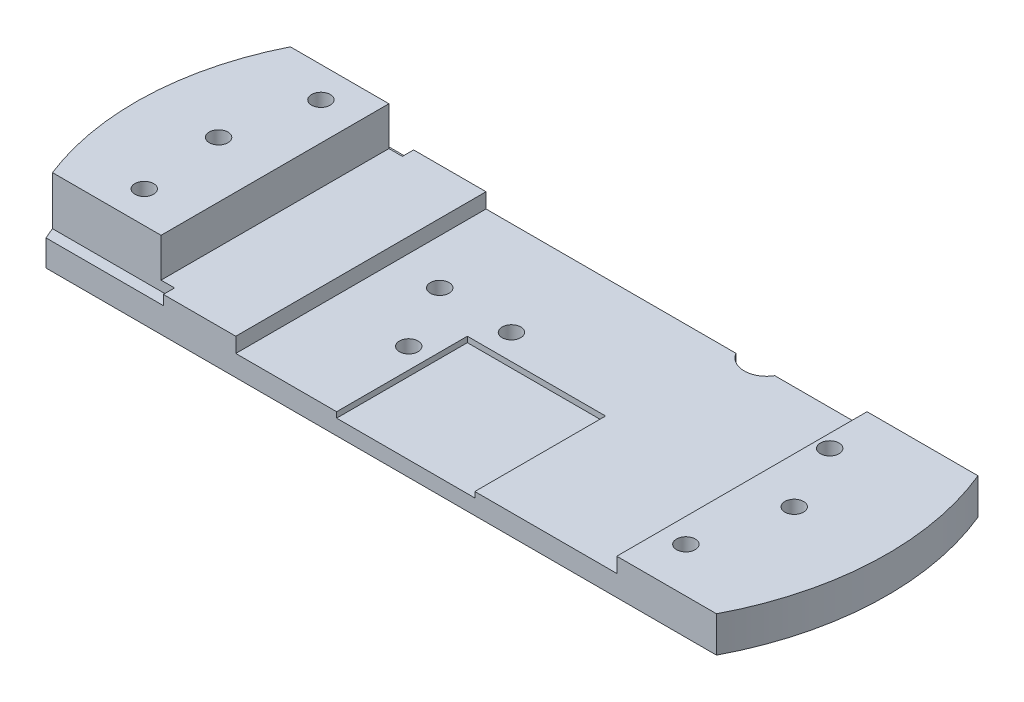
ISO-10303-21;
HEADER;
FILE_DESCRIPTION(('STEP AP214'),'2;1');
FILE_NAME('part.step','',(''),(''),'','','');
FILE_SCHEMA(('AUTOMOTIVE_DESIGN { 1 0 10303 214 1 1 1 1 }'));
ENDSEC;
DATA;
#1=APPLICATION_CONTEXT('core data for automotive mechanical design processes');
#2=APPLICATION_PROTOCOL_DEFINITION('international standard','automotive_design',2000,#1);
#3=PRODUCT_CONTEXT('',#1,'mechanical');
#4=PRODUCT('Part','Part','',(#3));
#5=PRODUCT_RELATED_PRODUCT_CATEGORY('part','',(#4));
#6=PRODUCT_DEFINITION_FORMATION('','',#4);
#7=PRODUCT_DEFINITION_CONTEXT('part definition',#1,'design');
#8=PRODUCT_DEFINITION('design','',#6,#7);
#9=PRODUCT_DEFINITION_SHAPE('','',#8);
#10=(LENGTH_UNIT() NAMED_UNIT(*) SI_UNIT(.MILLI.,.METRE.));
#11=(NAMED_UNIT(*) PLANE_ANGLE_UNIT() SI_UNIT($,.RADIAN.));
#12=(NAMED_UNIT(*) SI_UNIT($,.STERADIAN.) SOLID_ANGLE_UNIT());
#13=UNCERTAINTY_MEASURE_WITH_UNIT(LENGTH_MEASURE(1.E-05),#10,'distance_accuracy_value','');
#14=(GEOMETRIC_REPRESENTATION_CONTEXT(3) GLOBAL_UNCERTAINTY_ASSIGNED_CONTEXT((#13)) GLOBAL_UNIT_ASSIGNED_CONTEXT((#10,
#11,#12)) REPRESENTATION_CONTEXT('',''));
#15=CARTESIAN_POINT('',(0.,0.,0.));
#16=DIRECTION('',(0.,0.,1.));
#17=DIRECTION('',(1.,0.,0.));
#18=AXIS2_PLACEMENT_3D('',#15,#16,#17);
#19=CARTESIAN_POINT('',(0.,20.,0.));
#20=DIRECTION('',(0.,-1.,0.));
#21=DIRECTION('',(0.,0.,-1.));
#22=AXIS2_PLACEMENT_3D('',#19,#20,#21);
#23=PLANE('',#22);
#24=CARTESIAN_POINT('',(-76.2,20.,22.));
#25=DIRECTION('',(0.,-1.,0.));
#26=DIRECTION('',(0.,0.,-1.));
#27=AXIS2_PLACEMENT_3D('',#24,#25,#26);
#28=CIRCLE('',#27,2.50000000000001);
#29=CARTESIAN_POINT('',(-76.2,20.,19.5));
#30=VERTEX_POINT('',#29);
#31=EDGE_CURVE('E300',#30,#30,#28,.T.);
#32=ORIENTED_EDGE('',*,*,#31,.T.);
#33=EDGE_LOOP('',(#32));
#34=FACE_BOUND('',#33,.T.);
#35=CARTESIAN_POINT('',(-78.2,20.,0.100000000000003));
#36=DIRECTION('',(0.,-1.,0.));
#37=DIRECTION('',(0.,0.,-1.));
#38=AXIS2_PLACEMENT_3D('',#35,#36,#37);
#39=CIRCLE('',#38,2.49999999999999);
#40=CARTESIAN_POINT('',(-78.2,20.,-2.39999999999999));
#41=VERTEX_POINT('',#40);
#42=EDGE_CURVE('E306',#41,#41,#39,.T.);
#43=ORIENTED_EDGE('',*,*,#42,.T.);
#44=EDGE_LOOP('',(#43));
#45=FACE_BOUND('',#44,.T.);
#46=CARTESIAN_POINT('',(-73.2,20.,-22.3));
#47=DIRECTION('',(0.,-1.,0.));
#48=DIRECTION('',(0.,0.,-1.));
#49=AXIS2_PLACEMENT_3D('',#46,#47,#48);
#50=CIRCLE('',#49,2.50000000000001);
#51=CARTESIAN_POINT('',(-73.2,20.,-24.8));
#52=VERTEX_POINT('',#51);
#53=EDGE_CURVE('E278',#52,#52,#50,.T.);
#54=ORIENTED_EDGE('',*,*,#53,.T.);
#55=EDGE_LOOP('',(#54));
#56=FACE_BOUND('',#55,.T.);
#57=DIRECTION('',(-1.,0.,0.));
#58=VECTOR('',#57,1.);
#59=CARTESIAN_POINT('',(0.,20.,-30.5));
#60=LINE('',#59,#58);
#61=CARTESIAN_POINT('',(-63.2,20.,-30.5));
#62=VERTEX_POINT('',#61);
#63=CARTESIAN_POINT('',(-89.5873446539231,20.,-30.5));
#64=VERTEX_POINT('',#63);
#65=EDGE_CURVE('E317',#62,#64,#60,.T.);
#66=ORIENTED_EDGE('',*,*,#65,.T.);
#67=CARTESIAN_POINT('',(-22.6589151875398,20.,2.99288439458776));
#68=DIRECTION('',(0.,-1.,0.));
#69=DIRECTION('',(0.,0.,-1.));
#70=AXIS2_PLACEMENT_3D('',#67,#68,#69);
#71=CIRCLE('',#70,74.8410848124602);
#72=CARTESIAN_POINT('',(-92.2616921937509,20.,30.5));
#73=VERTEX_POINT('',#72);
#74=EDGE_CURVE('E414',#73,#64,#71,.T.);
#75=ORIENTED_EDGE('',*,*,#74,.F.);
#76=DIRECTION('',(-1.,0.,0.));
#77=VECTOR('',#76,1.);
#78=CARTESIAN_POINT('',(0.,20.,30.5));
#79=LINE('',#78,#77);
#80=CARTESIAN_POINT('',(-63.2,20.,30.5));
#81=VERTEX_POINT('',#80);
#82=EDGE_CURVE('E339',#81,#73,#79,.T.);
#83=ORIENTED_EDGE('',*,*,#82,.F.);
#84=DIRECTION('',(0.,0.,1.));
#85=VECTOR('',#84,1.);
#86=CARTESIAN_POINT('',(-63.2,20.,-33.5));
#87=LINE('',#86,#85);
#88=EDGE_CURVE('E399',#62,#81,#87,.T.);
#89=ORIENTED_EDGE('',*,*,#88,.F.);
#90=EDGE_LOOP('',(#66,#75,#83,#89));
#91=FACE_BOUND('',#90,.T.);
#92=ADVANCED_FACE('F84',(#34,#45,#56,#91),#23,.F.);
#93=CARTESIAN_POINT('',(-97.5,20.,-33.5));
#94=DIRECTION('',(0.,0.,1.));
#95=DIRECTION('',(1.,0.,0.));
#96=AXIS2_PLACEMENT_3D('',#93,#94,#95);
#97=PLANE('',#96);
#98=DIRECTION('',(1.,0.,0.));
#99=VECTOR('',#98,1.);
#100=CARTESIAN_POINT('',(0.,1.5,-33.5));
#101=LINE('',#100,#99);
#102=CARTESIAN_POINT('',(26.7038475772934,1.5,-33.5));
#103=VERTEX_POINT('',#102);
#104=CARTESIAN_POINT('',(37.0961524227066,1.5,-33.5));
#105=VERTEX_POINT('',#104);
#106=EDGE_CURVE('E234',#103,#105,#101,.T.);
#107=ORIENTED_EDGE('',*,*,#106,.T.);
#108=DIRECTION('',(0.,1.,0.));
#109=VECTOR('',#108,1.);
#110=CARTESIAN_POINT('',(37.0961524227066,1.5,-33.5));
#111=LINE('',#110,#109);
#112=CARTESIAN_POINT('',(37.0961524227066,5.6,-33.5));
#113=VERTEX_POINT('',#112);
#114=EDGE_CURVE('E241',#105,#113,#111,.T.);
#115=ORIENTED_EDGE('',*,*,#114,.T.);
#116=DIRECTION('',(1.,0.,0.));
#117=VECTOR('',#116,1.);
#118=CARTESIAN_POINT('',(0.,5.6,-33.5));
#119=LINE('',#118,#117);
#120=CARTESIAN_POINT('',(61.8,5.59999999999999,-33.5));
#121=VERTEX_POINT('',#120);
#122=EDGE_CURVE('E372',#113,#121,#119,.T.);
#123=ORIENTED_EDGE('',*,*,#122,.T.);
#124=DIRECTION('',(0.,1.,0.));
#125=VECTOR('',#124,1.);
#126=CARTESIAN_POINT('',(61.8,0.,-33.5));
#127=LINE('',#126,#125);
#128=CARTESIAN_POINT('',(61.8,9.59999999999997,-33.5));
#129=VERTEX_POINT('',#128);
#130=EDGE_CURVE('E361',#121,#129,#127,.T.);
#131=ORIENTED_EDGE('',*,*,#130,.T.);
#132=DIRECTION('',(1.,0.,0.));
#133=VECTOR('',#132,1.);
#134=CARTESIAN_POINT('',(0.,9.6,-33.5));
#135=LINE('',#134,#133);
#136=CARTESIAN_POINT('',(91.5,9.59999999999996,-33.5));
#137=VERTEX_POINT('',#136);
#138=EDGE_CURVE('E364',#129,#137,#135,.T.);
#139=ORIENTED_EDGE('',*,*,#138,.T.);
#140=DIRECTION('',(0.,-1.,0.));
#141=VECTOR('',#140,1.);
#142=CARTESIAN_POINT('',(91.5,20.,-33.5));
#143=LINE('',#142,#141);
#144=CARTESIAN_POINT('',(91.5,0.,-33.5));
#145=VERTEX_POINT('',#144);
#146=EDGE_CURVE('E403',#137,#145,#143,.T.);
#147=ORIENTED_EDGE('',*,*,#146,.T.);
#148=DIRECTION('',(-1.,0.,0.));
#149=VECTOR('',#148,1.);
#150=CARTESIAN_POINT('',(-97.5,0.,-33.5));
#151=LINE('',#150,#149);
#152=CARTESIAN_POINT('',(-88.,0.,-33.5));
#153=VERTEX_POINT('',#152);
#154=EDGE_CURVE('E413',#145,#153,#151,.T.);
#155=ORIENTED_EDGE('',*,*,#154,.T.);
#156=DIRECTION('',(0.,-1.,0.));
#157=VECTOR('',#156,1.);
#158=CARTESIAN_POINT('',(-88.,20.,-33.5));
#159=LINE('',#158,#157);
#160=CARTESIAN_POINT('',(-88.,7.,-33.5));
#161=VERTEX_POINT('',#160);
#162=EDGE_CURVE('E390',#161,#153,#159,.T.);
#163=ORIENTED_EDGE('',*,*,#162,.F.);
#164=DIRECTION('',(-1.,0.,0.));
#165=VECTOR('',#164,1.);
#166=CARTESIAN_POINT('',(0.,7.,-33.5));
#167=LINE('',#166,#165);
#168=CARTESIAN_POINT('',(-59.5873446539231,7.,-33.5));
#169=VERTEX_POINT('',#168);
#170=EDGE_CURVE('E319',#169,#161,#167,.T.);
#171=ORIENTED_EDGE('',*,*,#170,.F.);
#172=DIRECTION('',(0.,1.,0.));
#173=VECTOR('',#172,1.);
#174=CARTESIAN_POINT('',(-59.5873446539231,7.,-33.5));
#175=LINE('',#174,#173);
#176=CARTESIAN_POINT('',(-59.5873446539231,9.6,-33.5));
#177=VERTEX_POINT('',#176);
#178=EDGE_CURVE('E331',#169,#177,#175,.T.);
#179=ORIENTED_EDGE('',*,*,#178,.T.);
#180=DIRECTION('',(1.,0.,0.));
#181=VECTOR('',#180,1.);
#182=CARTESIAN_POINT('',(0.,9.6,-33.5));
#183=LINE('',#182,#181);
#184=CARTESIAN_POINT('',(-40.2,9.6,-33.5));
#185=VERTEX_POINT('',#184);
#186=EDGE_CURVE('E368',#177,#185,#183,.T.);
#187=ORIENTED_EDGE('',*,*,#186,.T.);
#188=DIRECTION('',(0.,-1.,0.));
#189=VECTOR('',#188,1.);
#190=CARTESIAN_POINT('',(-40.1999999999999,-2.7894353493707E-13,-33.5));
#191=LINE('',#190,#189);
#192=CARTESIAN_POINT('',(-40.2,5.6,-33.5));
#193=VERTEX_POINT('',#192);
#194=EDGE_CURVE('E370',#185,#193,#191,.T.);
#195=ORIENTED_EDGE('',*,*,#194,.T.);
#196=CARTESIAN_POINT('',(26.7038475772934,5.6,-33.5));
#197=VERTEX_POINT('',#196);
#198=EDGE_CURVE('E246',#193,#197,#119,.T.);
#199=ORIENTED_EDGE('',*,*,#198,.T.);
#200=DIRECTION('',(0.,1.,0.));
#201=VECTOR('',#200,1.);
#202=CARTESIAN_POINT('',(26.7038475772934,1.5,-33.5));
#203=LINE('',#202,#201);
#204=EDGE_CURVE('E99',#103,#197,#203,.T.);
#205=ORIENTED_EDGE('',*,*,#204,.F.);
#206=EDGE_LOOP('',(#107,#115,#123,#131,#139,#147,#155,#163,#171,#179,#187,#195,#199,#205));
#207=FACE_BOUND('',#206,.T.);
#208=ADVANCED_FACE('F86',(#207),#97,.F.);
#209=CARTESIAN_POINT('',(-22.6589151875398,20.,2.99288439458776));
#210=DIRECTION('',(0.,-1.,0.));
#211=DIRECTION('',(0.,0.,-1.));
#212=AXIS2_PLACEMENT_3D('',#209,#210,#211);
#213=CYLINDRICAL_SURFACE('',#212,74.8410848124602);
#214=ORIENTED_EDGE('',*,*,#74,.T.);
#215=DIRECTION('',(0.,1.,0.));
#216=VECTOR('',#215,1.);
#217=CARTESIAN_POINT('',(-89.5873446539231,7.,-30.5));
#218=LINE('',#217,#216);
#219=CARTESIAN_POINT('',(-89.5873446539231,7.,-30.5));
#220=VERTEX_POINT('',#219);
#221=EDGE_CURVE('E328',#220,#64,#218,.T.);
#222=ORIENTED_EDGE('',*,*,#221,.F.);
#223=CARTESIAN_POINT('',(-22.6589151875398,7.,2.99288439458776));
#224=DIRECTION('',(0.,1.,0.));
#225=DIRECTION('',(0.,0.,1.));
#226=AXIS2_PLACEMENT_3D('',#223,#224,#225);
#227=CIRCLE('',#226,74.8410848124602);
#228=EDGE_CURVE('E321',#161,#220,#227,.T.);
#229=ORIENTED_EDGE('',*,*,#228,.F.);
#230=ORIENTED_EDGE('',*,*,#162,.T.);
#231=CARTESIAN_POINT('',(-22.6589151875398,0.,2.99288439458776));
#232=DIRECTION('',(0.,-1.,0.));
#233=DIRECTION('',(0.,0.,-1.));
#234=AXIS2_PLACEMENT_3D('',#231,#232,#233);
#235=CIRCLE('',#234,74.8410848124602);
#236=CARTESIAN_POINT('',(-91.,0.,33.5));
#237=VERTEX_POINT('',#236);
#238=EDGE_CURVE('E405',#237,#153,#235,.T.);
#239=ORIENTED_EDGE('',*,*,#238,.F.);
#240=DIRECTION('',(0.,-1.,0.));
#241=VECTOR('',#240,1.);
#242=CARTESIAN_POINT('',(-91.,20.,33.5));
#243=LINE('',#242,#241);
#244=CARTESIAN_POINT('',(-91.,7.,33.5));
#245=VERTEX_POINT('',#244);
#246=EDGE_CURVE('E411',#245,#237,#243,.T.);
#247=ORIENTED_EDGE('',*,*,#246,.F.);
#248=CARTESIAN_POINT('',(-22.6589151875398,7.,2.99288439458776));
#249=DIRECTION('',(0.,1.,0.));
#250=DIRECTION('',(0.,0.,1.));
#251=AXIS2_PLACEMENT_3D('',#248,#249,#250);
#252=CIRCLE('',#251,74.8410848124602);
#253=CARTESIAN_POINT('',(-92.2616921937509,7.,30.5));
#254=VERTEX_POINT('',#253);
#255=EDGE_CURVE('E345',#254,#245,#252,.T.);
#256=ORIENTED_EDGE('',*,*,#255,.F.);
#257=DIRECTION('',(0.,1.,0.));
#258=VECTOR('',#257,1.);
#259=CARTESIAN_POINT('',(-92.2616921937509,7.,30.5));
#260=LINE('',#259,#258);
#261=EDGE_CURVE('E327',#254,#73,#260,.T.);
#262=ORIENTED_EDGE('',*,*,#261,.T.);
#263=EDGE_LOOP('',(#214,#222,#229,#230,#239,#247,#256,#262));
#264=FACE_BOUND('',#263,.T.);
#265=ADVANCED_FACE('F479',(#264),#213,.T.);
#266=CARTESIAN_POINT('',(-63.2,0.,-33.5));
#267=DIRECTION('',(-1.,0.,0.));
#268=DIRECTION('',(0.,-1.,0.));
#269=AXIS2_PLACEMENT_3D('',#266,#267,#268);
#270=PLANE('',#269);
#271=DIRECTION('',(0.,-1.,0.));
#272=VECTOR('',#271,1.);
#273=CARTESIAN_POINT('',(-63.2,0.,-30.5));
#274=LINE('',#273,#272);
#275=CARTESIAN_POINT('',(-63.2,9.6,-30.5));
#276=VERTEX_POINT('',#275);
#277=EDGE_CURVE('E358',#62,#276,#274,.T.);
#278=ORIENTED_EDGE('',*,*,#277,.F.);
#279=ORIENTED_EDGE('',*,*,#88,.T.);
#280=DIRECTION('',(0.,-1.,0.));
#281=VECTOR('',#280,1.);
#282=CARTESIAN_POINT('',(-63.2,0.,30.5));
#283=LINE('',#282,#281);
#284=CARTESIAN_POINT('',(-63.2,9.6,30.5));
#285=VERTEX_POINT('',#284);
#286=EDGE_CURVE('E330',#81,#285,#283,.T.);
#287=ORIENTED_EDGE('',*,*,#286,.T.);
#288=DIRECTION('',(0.,0.,1.));
#289=VECTOR('',#288,1.);
#290=CARTESIAN_POINT('',(-63.2,9.6,-33.5));
#291=LINE('',#290,#289);
#292=EDGE_CURVE('E396',#276,#285,#291,.T.);
#293=ORIENTED_EDGE('',*,*,#292,.F.);
#294=EDGE_LOOP('',(#278,#279,#287,#293));
#295=FACE_BOUND('',#294,.T.);
#296=ADVANCED_FACE('F597',(#295),#270,.F.);
#297=CARTESIAN_POINT('',(0.,9.6,-33.5));
#298=DIRECTION('',(0.,-1.,0.));
#299=DIRECTION('',(0.,0.,-1.));
#300=AXIS2_PLACEMENT_3D('',#297,#298,#299);
#301=PLANE('',#300);
#302=DIRECTION('',(1.,0.,0.));
#303=VECTOR('',#302,1.);
#304=CARTESIAN_POINT('',(0.,9.6,-30.5));
#305=LINE('',#304,#303);
#306=CARTESIAN_POINT('',(-59.5873446539231,9.6,-30.5));
#307=VERTEX_POINT('',#306);
#308=EDGE_CURVE('E92',#276,#307,#305,.T.);
#309=ORIENTED_EDGE('',*,*,#308,.F.);
#310=ORIENTED_EDGE('',*,*,#292,.T.);
#311=DIRECTION('',(1.,0.,0.));
#312=VECTOR('',#311,1.);
#313=CARTESIAN_POINT('',(0.,9.6,30.5));
#314=LINE('',#313,#312);
#315=CARTESIAN_POINT('',(-59.5873446539231,9.6,30.5));
#316=VERTEX_POINT('',#315);
#317=EDGE_CURVE('E430',#285,#316,#314,.T.);
#318=ORIENTED_EDGE('',*,*,#317,.T.);
#319=DIRECTION('',(0.,0.,1.));
#320=VECTOR('',#319,1.);
#321=CARTESIAN_POINT('',(-59.5873446539233,9.6,-33.4999999999999));
#322=LINE('',#321,#320);
#323=CARTESIAN_POINT('',(-59.5873446539231,9.6,33.5));
#324=VERTEX_POINT('',#323);
#325=EDGE_CURVE('E427',#316,#324,#322,.T.);
#326=ORIENTED_EDGE('',*,*,#325,.T.);
#327=DIRECTION('',(1.,0.,0.));
#328=VECTOR('',#327,1.);
#329=CARTESIAN_POINT('',(0.,9.6,33.5));
#330=LINE('',#329,#328);
#331=CARTESIAN_POINT('',(-40.2,9.6,33.5));
#332=VERTEX_POINT('',#331);
#333=EDGE_CURVE('E379',#324,#332,#330,.T.);
#334=ORIENTED_EDGE('',*,*,#333,.T.);
#335=DIRECTION('',(0.,0.,1.));
#336=VECTOR('',#335,1.);
#337=CARTESIAN_POINT('',(-40.2,9.6,-33.5));
#338=LINE('',#337,#336);
#339=EDGE_CURVE('E393',#185,#332,#338,.T.);
#340=ORIENTED_EDGE('',*,*,#339,.F.);
#341=ORIENTED_EDGE('',*,*,#186,.F.);
#342=DIRECTION('',(0.,0.,-1.));
#343=VECTOR('',#342,1.);
#344=CARTESIAN_POINT('',(-59.5873446539231,9.6,-33.5));
#345=LINE('',#344,#343);
#346=EDGE_CURVE('E433',#307,#177,#345,.T.);
#347=ORIENTED_EDGE('',*,*,#346,.F.);
#348=EDGE_LOOP('',(#309,#310,#318,#326,#334,#340,#341,#347));
#349=FACE_BOUND('',#348,.T.);
#350=ADVANCED_FACE('F487',(#349),#301,.F.);
#351=CARTESIAN_POINT('',(0.,0.,0.));
#352=DIRECTION('',(0.,-1.,0.));
#353=DIRECTION('',(0.,0.,-1.));
#354=AXIS2_PLACEMENT_3D('',#351,#352,#353);
#355=PLANE('',#354);
#356=CARTESIAN_POINT('',(-8.20000000000003,0.,-8.3));
#357=DIRECTION('',(0.,-1.,0.));
#358=DIRECTION('',(0.,0.,-1.));
#359=AXIS2_PLACEMENT_3D('',#356,#357,#358);
#360=CIRCLE('',#359,2.5);
#361=CARTESIAN_POINT('',(-8.20000000000003,0.,-10.8));
#362=VERTEX_POINT('',#361);
#363=EDGE_CURVE('E293',#362,#362,#360,.T.);
#364=ORIENTED_EDGE('',*,*,#363,.F.);
#365=EDGE_LOOP('',(#364));
#366=FACE_BOUND('',#365,.T.);
#367=CARTESIAN_POINT('',(-18.7,0.,8.7));
#368=DIRECTION('',(0.,-1.,0.));
#369=DIRECTION('',(0.,0.,-1.));
#370=AXIS2_PLACEMENT_3D('',#367,#368,#369);
#371=CIRCLE('',#370,2.5);
#372=CARTESIAN_POINT('',(-18.7,0.,6.2));
#373=VERTEX_POINT('',#372);
#374=EDGE_CURVE('E297',#373,#373,#371,.T.);
#375=ORIENTED_EDGE('',*,*,#374,.F.);
#376=EDGE_LOOP('',(#375));
#377=FACE_BOUND('',#376,.T.);
#378=CARTESIAN_POINT('',(-76.2,0.,22.));
#379=DIRECTION('',(0.,-1.,0.));
#380=DIRECTION('',(0.,0.,-1.));
#381=AXIS2_PLACEMENT_3D('',#378,#379,#380);
#382=CIRCLE('',#381,2.50000000000001);
#383=CARTESIAN_POINT('',(-76.2,0.,19.5));
#384=VERTEX_POINT('',#383);
#385=EDGE_CURVE('E303',#384,#384,#382,.T.);
#386=ORIENTED_EDGE('',*,*,#385,.F.);
#387=EDGE_LOOP('',(#386));
#388=FACE_BOUND('',#387,.T.);
#389=CARTESIAN_POINT('',(-78.2,0.,0.100000000000003));
#390=DIRECTION('',(0.,-1.,0.));
#391=DIRECTION('',(0.,0.,-1.));
#392=AXIS2_PLACEMENT_3D('',#389,#390,#391);
#393=CIRCLE('',#392,2.49999999999999);
#394=CARTESIAN_POINT('',(-78.2,0.,-2.39999999999999));
#395=VERTEX_POINT('',#394);
#396=EDGE_CURVE('E281',#395,#395,#393,.T.);
#397=ORIENTED_EDGE('',*,*,#396,.F.);
#398=EDGE_LOOP('',(#397));
#399=FACE_BOUND('',#398,.T.);
#400=CARTESIAN_POINT('',(-73.2,0.,-22.3));
#401=DIRECTION('',(0.,-1.,0.));
#402=DIRECTION('',(0.,0.,-1.));
#403=AXIS2_PLACEMENT_3D('',#400,#401,#402);
#404=CIRCLE('',#403,2.50000000000001);
#405=CARTESIAN_POINT('',(-73.2,0.,-24.8));
#406=VERTEX_POINT('',#405);
#407=EDGE_CURVE('E282',#406,#406,#404,.T.);
#408=ORIENTED_EDGE('',*,*,#407,.F.);
#409=EDGE_LOOP('',(#408));
#410=FACE_BOUND('',#409,.T.);
#411=CARTESIAN_POINT('',(65.3,0.,-20.));
#412=DIRECTION('',(0.,-1.,0.));
#413=DIRECTION('',(0.,0.,-1.));
#414=AXIS2_PLACEMENT_3D('',#411,#412,#413);
#415=CIRCLE('',#414,2.50000000000001);
#416=CARTESIAN_POINT('',(65.3,0.,-22.5));
#417=VERTEX_POINT('',#416);
#418=EDGE_CURVE('E285',#417,#417,#415,.T.);
#419=ORIENTED_EDGE('',*,*,#418,.F.);
#420=EDGE_LOOP('',(#419));
#421=FACE_BOUND('',#420,.T.);
#422=CARTESIAN_POINT('',(74.1,0.,-1.7));
#423=DIRECTION('',(0.,-1.,0.));
#424=DIRECTION('',(0.,0.,-1.));
#425=AXIS2_PLACEMENT_3D('',#422,#423,#424);
#426=CIRCLE('',#425,2.5);
#427=CARTESIAN_POINT('',(74.1,0.,-4.2));
#428=VERTEX_POINT('',#427);
#429=EDGE_CURVE('E288',#428,#428,#426,.T.);
#430=ORIENTED_EDGE('',*,*,#429,.F.);
#431=EDGE_LOOP('',(#430));
#432=FACE_BOUND('',#431,.T.);
#433=CARTESIAN_POINT('',(68.3,0.,21.5));
#434=DIRECTION('',(0.,-1.,0.));
#435=DIRECTION('',(0.,0.,-1.));
#436=AXIS2_PLACEMENT_3D('',#433,#434,#435);
#437=CIRCLE('',#436,2.5);
#438=CARTESIAN_POINT('',(68.3,0.,19.));
#439=VERTEX_POINT('',#438);
#440=EDGE_CURVE('E272',#439,#439,#437,.T.);
#441=ORIENTED_EDGE('',*,*,#440,.F.);
#442=EDGE_LOOP('',(#441));
#443=FACE_BOUND('',#442,.T.);
#444=CARTESIAN_POINT('',(-28.1,0.,-9.));
#445=DIRECTION('',(0.,-1.,0.));
#446=DIRECTION('',(0.,0.,-1.));
#447=AXIS2_PLACEMENT_3D('',#444,#445,#446);
#448=CIRCLE('',#447,2.5);
#449=CARTESIAN_POINT('',(-28.1,0.,-11.5));
#450=VERTEX_POINT('',#449);
#451=EDGE_CURVE('E296',#450,#450,#448,.T.);
#452=ORIENTED_EDGE('',*,*,#451,.F.);
#453=EDGE_LOOP('',(#452));
#454=FACE_BOUND('',#453,.T.);
#455=ORIENTED_EDGE('',*,*,#154,.F.);
#456=CARTESIAN_POINT('',(18.092213290183,0.,-3.21975164372315));
#457=DIRECTION('',(0.,-1.,0.));
#458=DIRECTION('',(0.,0.,-1.));
#459=AXIS2_PLACEMENT_3D('',#456,#457,#458);
#460=CIRCLE('',#459,79.407786709817);
#461=CARTESIAN_POINT('',(88.5,0.,33.5));
#462=VERTEX_POINT('',#461);
#463=EDGE_CURVE('E407',#145,#462,#460,.T.);
#464=ORIENTED_EDGE('',*,*,#463,.T.);
#465=DIRECTION('',(1.,0.,0.));
#466=VECTOR('',#465,1.);
#467=CARTESIAN_POINT('',(-97.5,0.,33.5));
#468=LINE('',#467,#466);
#469=EDGE_CURVE('E422',#237,#462,#468,.T.);
#470=ORIENTED_EDGE('',*,*,#469,.F.);
#471=ORIENTED_EDGE('',*,*,#238,.T.);
#472=EDGE_LOOP('',(#455,#464,#470,#471));
#473=FACE_BOUND('',#472,.T.);
#474=ADVANCED_FACE('F484',(#366,#377,#388,#399,#410,#421,#432,#443,#454,#473),#355,.T.);
#475=CARTESIAN_POINT('',(-97.5,20.,33.5));
#476=DIRECTION('',(0.,0.,-1.));
#477=DIRECTION('',(-1.,0.,0.));
#478=AXIS2_PLACEMENT_3D('',#475,#476,#477);
#479=PLANE('',#478);
#480=DIRECTION('',(1.,0.,0.));
#481=VECTOR('',#480,1.);
#482=CARTESIAN_POINT('',(-13.2,4.1,33.5));
#483=LINE('',#482,#481);
#484=CARTESIAN_POINT('',(-13.2,4.1,33.5));
#485=VERTEX_POINT('',#484);
#486=CARTESIAN_POINT('',(23.8,4.1,33.5));
#487=VERTEX_POINT('',#486);
#488=EDGE_CURVE('E254',#485,#487,#483,.T.);
#489=ORIENTED_EDGE('',*,*,#488,.F.);
#490=DIRECTION('',(0.,1.,0.));
#491=VECTOR('',#490,1.);
#492=CARTESIAN_POINT('',(-13.2,4.1,33.5));
#493=LINE('',#492,#491);
#494=CARTESIAN_POINT('',(-13.2,5.6,33.5));
#495=VERTEX_POINT('',#494);
#496=EDGE_CURVE('E264',#485,#495,#493,.T.);
#497=ORIENTED_EDGE('',*,*,#496,.T.);
#498=DIRECTION('',(1.,0.,0.));
#499=VECTOR('',#498,1.);
#500=CARTESIAN_POINT('',(0.,5.6,33.5));
#501=LINE('',#500,#499);
#502=CARTESIAN_POINT('',(-40.2,5.6,33.5));
#503=VERTEX_POINT('',#502);
#504=EDGE_CURVE('E365',#503,#495,#501,.T.);
#505=ORIENTED_EDGE('',*,*,#504,.F.);
#506=DIRECTION('',(0.,-1.,0.));
#507=VECTOR('',#506,1.);
#508=CARTESIAN_POINT('',(-40.1999999999999,-2.7894353493707E-13,33.5));
#509=LINE('',#508,#507);
#510=EDGE_CURVE('E381',#332,#503,#509,.T.);
#511=ORIENTED_EDGE('',*,*,#510,.F.);
#512=ORIENTED_EDGE('',*,*,#333,.F.);
#513=DIRECTION('',(0.,1.,0.));
#514=VECTOR('',#513,1.);
#515=CARTESIAN_POINT('',(-59.5873446539231,7.,33.5));
#516=LINE('',#515,#514);
#517=CARTESIAN_POINT('',(-59.5873446539231,7.,33.5));
#518=VERTEX_POINT('',#517);
#519=EDGE_CURVE('E347',#518,#324,#516,.T.);
#520=ORIENTED_EDGE('',*,*,#519,.F.);
#521=DIRECTION('',(1.,0.,0.));
#522=VECTOR('',#521,1.);
#523=CARTESIAN_POINT('',(0.,7.,33.5));
#524=LINE('',#523,#522);
#525=EDGE_CURVE('E335',#245,#518,#524,.T.);
#526=ORIENTED_EDGE('',*,*,#525,.F.);
#527=ORIENTED_EDGE('',*,*,#246,.T.);
#528=ORIENTED_EDGE('',*,*,#469,.T.);
#529=DIRECTION('',(0.,-1.,0.));
#530=VECTOR('',#529,1.);
#531=CARTESIAN_POINT('',(88.5,20.,33.5));
#532=LINE('',#531,#530);
#533=CARTESIAN_POINT('',(88.5,9.59999999999996,33.5));
#534=VERTEX_POINT('',#533);
#535=EDGE_CURVE('E410',#534,#462,#532,.T.);
#536=ORIENTED_EDGE('',*,*,#535,.F.);
#537=DIRECTION('',(1.,0.,0.));
#538=VECTOR('',#537,1.);
#539=CARTESIAN_POINT('',(0.,9.6,33.5));
#540=LINE('',#539,#538);
#541=CARTESIAN_POINT('',(61.8,9.59999999999997,33.5));
#542=VERTEX_POINT('',#541);
#543=EDGE_CURVE('E377',#542,#534,#540,.T.);
#544=ORIENTED_EDGE('',*,*,#543,.F.);
#545=DIRECTION('',(0.,1.,0.));
#546=VECTOR('',#545,1.);
#547=CARTESIAN_POINT('',(61.8,0.,33.5));
#548=LINE('',#547,#546);
#549=CARTESIAN_POINT('',(61.8,5.59999999999999,33.5));
#550=VERTEX_POINT('',#549);
#551=EDGE_CURVE('E360',#550,#542,#548,.T.);
#552=ORIENTED_EDGE('',*,*,#551,.F.);
#553=CARTESIAN_POINT('',(23.8,5.6,33.5));
#554=VERTEX_POINT('',#553);
#555=EDGE_CURVE('E384',#554,#550,#501,.T.);
#556=ORIENTED_EDGE('',*,*,#555,.F.);
#557=DIRECTION('',(0.,1.,0.));
#558=VECTOR('',#557,1.);
#559=CARTESIAN_POINT('',(23.8,4.1,33.5));
#560=LINE('',#559,#558);
#561=EDGE_CURVE('E106',#487,#554,#560,.T.);
#562=ORIENTED_EDGE('',*,*,#561,.F.);
#563=EDGE_LOOP('',(#489,#497,#505,#511,#512,#520,#526,#527,#528,#536,#544,#552,#556,#562));
#564=FACE_BOUND('',#563,.T.);
#565=ADVANCED_FACE('F486',(#564),#479,.F.);
#566=CARTESIAN_POINT('',(18.092213290183,20.,-3.21975164372315));
#567=DIRECTION('',(0.,-1.,0.));
#568=DIRECTION('',(0.,0.,-1.));
#569=AXIS2_PLACEMENT_3D('',#566,#567,#568);
#570=CYLINDRICAL_SURFACE('',#569,79.407786709817);
#571=ORIENTED_EDGE('',*,*,#146,.F.);
#572=CARTESIAN_POINT('',(18.092213290183,9.59999999999999,-3.21975164372315));
#573=DIRECTION('',(0.,-1.,0.));
#574=DIRECTION('',(1.,0.,0.));
#575=AXIS2_PLACEMENT_3D('',#572,#573,#574);
#576=CIRCLE('',#575,79.407786709817);
#577=EDGE_CURVE('E425',#534,#137,#576,.F.);
#578=ORIENTED_EDGE('',*,*,#577,.F.);
#579=ORIENTED_EDGE('',*,*,#535,.T.);
#580=ORIENTED_EDGE('',*,*,#463,.F.);
#581=EDGE_LOOP('',(#571,#578,#579,#580));
#582=FACE_BOUND('',#581,.T.);
#583=ADVANCED_FACE('F490',(#582),#570,.T.);
#584=CARTESIAN_POINT('',(-40.1999999999999,-2.7894353493707E-13,-33.5));
#585=DIRECTION('',(-1.,0.,0.));
#586=DIRECTION('',(0.,-1.,0.));
#587=AXIS2_PLACEMENT_3D('',#584,#585,#586);
#588=PLANE('',#587);
#589=ORIENTED_EDGE('',*,*,#510,.T.);
#590=DIRECTION('',(0.,0.,1.));
#591=VECTOR('',#590,1.);
#592=CARTESIAN_POINT('',(-40.2,5.6,-33.5));
#593=LINE('',#592,#591);
#594=EDGE_CURVE('E391',#193,#503,#593,.T.);
#595=ORIENTED_EDGE('',*,*,#594,.F.);
#596=ORIENTED_EDGE('',*,*,#194,.F.);
#597=ORIENTED_EDGE('',*,*,#339,.T.);
#598=EDGE_LOOP('',(#589,#595,#596,#597));
#599=FACE_BOUND('',#598,.T.);
#600=ADVANCED_FACE('F495',(#599),#588,.F.);
#601=CARTESIAN_POINT('',(0.,5.6,-33.5));
#602=DIRECTION('',(0.,-1.,0.));
#603=DIRECTION('',(1.,0.,0.));
#604=AXIS2_PLACEMENT_3D('',#601,#602,#603);
#605=PLANE('',#604);
#606=CARTESIAN_POINT('',(-8.20000000000003,5.6,-8.3));
#607=DIRECTION('',(0.,-1.,0.));
#608=DIRECTION('',(1.,0.,0.));
#609=AXIS2_PLACEMENT_3D('',#606,#607,#608);
#610=CIRCLE('',#609,2.5);
#611=CARTESIAN_POINT('',(-5.70000000000003,5.6,-8.3));
#612=VERTEX_POINT('',#611);
#613=EDGE_CURVE('E349',#612,#612,#610,.T.);
#614=ORIENTED_EDGE('',*,*,#613,.T.);
#615=EDGE_LOOP('',(#614));
#616=FACE_BOUND('',#615,.T.);
#617=CARTESIAN_POINT('',(-18.7,5.6,8.7));
#618=DIRECTION('',(0.,-1.,0.));
#619=DIRECTION('',(1.,0.,0.));
#620=AXIS2_PLACEMENT_3D('',#617,#618,#619);
#621=CIRCLE('',#620,2.5);
#622=CARTESIAN_POINT('',(-16.2,5.6,8.7));
#623=VERTEX_POINT('',#622);
#624=EDGE_CURVE('E448',#623,#623,#621,.T.);
#625=ORIENTED_EDGE('',*,*,#624,.T.);
#626=EDGE_LOOP('',(#625));
#627=FACE_BOUND('',#626,.T.);
#628=CARTESIAN_POINT('',(-28.1,5.6,-9.));
#629=DIRECTION('',(0.,-1.,0.));
#630=DIRECTION('',(1.,0.,0.));
#631=AXIS2_PLACEMENT_3D('',#628,#629,#630);
#632=CIRCLE('',#631,2.5);
#633=CARTESIAN_POINT('',(-25.6,5.6,-9.));
#634=VERTEX_POINT('',#633);
#635=EDGE_CURVE('E445',#634,#634,#632,.T.);
#636=ORIENTED_EDGE('',*,*,#635,.T.);
#637=EDGE_LOOP('',(#636));
#638=FACE_BOUND('',#637,.T.);
#639=ORIENTED_EDGE('',*,*,#122,.F.);
#640=CARTESIAN_POINT('',(31.9,5.6,-36.5));
#641=DIRECTION('',(0.,-1.,0.));
#642=DIRECTION('',(1.,0.,0.));
#643=AXIS2_PLACEMENT_3D('',#640,#641,#642);
#644=CIRCLE('',#643,6.);
#645=EDGE_CURVE('E12',#113,#197,#644,.T.);
#646=ORIENTED_EDGE('',*,*,#645,.T.);
#647=ORIENTED_EDGE('',*,*,#198,.F.);
#648=ORIENTED_EDGE('',*,*,#594,.T.);
#649=ORIENTED_EDGE('',*,*,#504,.T.);
#650=DIRECTION('',(0.,0.,1.));
#651=VECTOR('',#650,1.);
#652=CARTESIAN_POINT('',(-13.2,5.6,-1.5));
#653=LINE('',#652,#651);
#654=CARTESIAN_POINT('',(-13.2,5.6,-1.5));
#655=VERTEX_POINT('',#654);
#656=EDGE_CURVE('E248',#655,#495,#653,.T.);
#657=ORIENTED_EDGE('',*,*,#656,.F.);
#658=DIRECTION('',(-1.,0.,0.));
#659=VECTOR('',#658,1.);
#660=CARTESIAN_POINT('',(-13.2,5.6,-1.5));
#661=LINE('',#660,#659);
#662=CARTESIAN_POINT('',(23.8,5.6,-1.5));
#663=VERTEX_POINT('',#662);
#664=EDGE_CURVE('E255',#663,#655,#661,.T.);
#665=ORIENTED_EDGE('',*,*,#664,.F.);
#666=DIRECTION('',(0.,0.,-1.));
#667=VECTOR('',#666,1.);
#668=CARTESIAN_POINT('',(23.8,5.6,-1.5));
#669=LINE('',#668,#667);
#670=EDGE_CURVE('E266',#554,#663,#669,.T.);
#671=ORIENTED_EDGE('',*,*,#670,.F.);
#672=ORIENTED_EDGE('',*,*,#555,.T.);
#673=DIRECTION('',(0.,0.,1.));
#674=VECTOR('',#673,1.);
#675=CARTESIAN_POINT('',(61.8,5.59999999999999,-33.5));
#676=LINE('',#675,#674);
#677=EDGE_CURVE('E387',#121,#550,#676,.T.);
#678=ORIENTED_EDGE('',*,*,#677,.F.);
#679=EDGE_LOOP('',(#639,#646,#647,#648,#649,#657,#665,#671,#672,#678));
#680=FACE_BOUND('',#679,.T.);
#681=ADVANCED_FACE('F453',(#616,#627,#638,#680),#605,.F.);
#682=CARTESIAN_POINT('',(61.8,0.,-33.5));
#683=DIRECTION('',(1.,0.,0.));
#684=DIRECTION('',(0.,0.,-1.));
#685=AXIS2_PLACEMENT_3D('',#682,#683,#684);
#686=PLANE('',#685);
#687=ORIENTED_EDGE('',*,*,#551,.T.);
#688=DIRECTION('',(0.,0.,1.));
#689=VECTOR('',#688,1.);
#690=CARTESIAN_POINT('',(61.8,9.59999999999997,-33.5));
#691=LINE('',#690,#689);
#692=EDGE_CURVE('E374',#129,#542,#691,.T.);
#693=ORIENTED_EDGE('',*,*,#692,.F.);
#694=ORIENTED_EDGE('',*,*,#130,.F.);
#695=ORIENTED_EDGE('',*,*,#677,.T.);
#696=EDGE_LOOP('',(#687,#693,#694,#695));
#697=FACE_BOUND('',#696,.T.);
#698=ADVANCED_FACE('F549',(#697),#686,.F.);
#699=CARTESIAN_POINT('',(0.,9.6,-33.5));
#700=DIRECTION('',(0.,-1.,0.));
#701=DIRECTION('',(1.,0.,0.));
#702=AXIS2_PLACEMENT_3D('',#699,#700,#701);
#703=PLANE('',#702);
#704=CARTESIAN_POINT('',(65.3,9.59999999999997,-20.));
#705=DIRECTION('',(0.,-1.,0.));
#706=DIRECTION('',(1.,0.,0.));
#707=AXIS2_PLACEMENT_3D('',#704,#705,#706);
#708=CIRCLE('',#707,2.50000000000001);
#709=CARTESIAN_POINT('',(67.8,9.59999999999997,-20.));
#710=VERTEX_POINT('',#709);
#711=EDGE_CURVE('E442',#710,#710,#708,.T.);
#712=ORIENTED_EDGE('',*,*,#711,.T.);
#713=EDGE_LOOP('',(#712));
#714=FACE_BOUND('',#713,.T.);
#715=CARTESIAN_POINT('',(74.1,9.59999999999997,-1.7));
#716=DIRECTION('',(0.,-1.,0.));
#717=DIRECTION('',(1.,0.,0.));
#718=AXIS2_PLACEMENT_3D('',#715,#716,#717);
#719=CIRCLE('',#718,2.5);
#720=CARTESIAN_POINT('',(76.6,9.59999999999997,-1.7));
#721=VERTEX_POINT('',#720);
#722=EDGE_CURVE('E439',#721,#721,#719,.T.);
#723=ORIENTED_EDGE('',*,*,#722,.T.);
#724=EDGE_LOOP('',(#723));
#725=FACE_BOUND('',#724,.T.);
#726=CARTESIAN_POINT('',(68.3,9.59999999999997,21.5));
#727=DIRECTION('',(0.,-1.,0.));
#728=DIRECTION('',(1.,0.,0.));
#729=AXIS2_PLACEMENT_3D('',#726,#727,#728);
#730=CIRCLE('',#729,2.5);
#731=CARTESIAN_POINT('',(70.8,9.59999999999997,21.5));
#732=VERTEX_POINT('',#731);
#733=EDGE_CURVE('E313',#732,#732,#730,.T.);
#734=ORIENTED_EDGE('',*,*,#733,.T.);
#735=EDGE_LOOP('',(#734));
#736=FACE_BOUND('',#735,.T.);
#737=ORIENTED_EDGE('',*,*,#577,.T.);
#738=ORIENTED_EDGE('',*,*,#138,.F.);
#739=ORIENTED_EDGE('',*,*,#692,.T.);
#740=ORIENTED_EDGE('',*,*,#543,.T.);
#741=EDGE_LOOP('',(#737,#738,#739,#740));
#742=FACE_BOUND('',#741,.T.);
#743=ADVANCED_FACE('F545',(#714,#725,#736,#742),#703,.F.);
#744=CARTESIAN_POINT('',(0.,7.,30.5));
#745=DIRECTION('',(0.,0.,-1.));
#746=DIRECTION('',(-1.,0.,0.));
#747=AXIS2_PLACEMENT_3D('',#744,#745,#746);
#748=PLANE('',#747);
#749=ORIENTED_EDGE('',*,*,#82,.T.);
#750=ORIENTED_EDGE('',*,*,#261,.F.);
#751=DIRECTION('',(-1.,0.,0.));
#752=VECTOR('',#751,1.);
#753=CARTESIAN_POINT('',(0.,7.,30.5));
#754=LINE('',#753,#752);
#755=CARTESIAN_POINT('',(-59.5873446539231,7.,30.5));
#756=VERTEX_POINT('',#755);
#757=EDGE_CURVE('E342',#756,#254,#754,.T.);
#758=ORIENTED_EDGE('',*,*,#757,.F.);
#759=DIRECTION('',(0.,1.,0.));
#760=VECTOR('',#759,1.);
#761=CARTESIAN_POINT('',(-59.5873446539231,7.,30.5));
#762=LINE('',#761,#760);
#763=EDGE_CURVE('E352',#756,#316,#762,.T.);
#764=ORIENTED_EDGE('',*,*,#763,.T.);
#765=ORIENTED_EDGE('',*,*,#317,.F.);
#766=ORIENTED_EDGE('',*,*,#286,.F.);
#767=EDGE_LOOP('',(#749,#750,#758,#764,#765,#766));
#768=FACE_BOUND('',#767,.T.);
#769=ADVANCED_FACE('F524',(#768),#748,.F.);
#770=CARTESIAN_POINT('',(-59.5873446539232,7.,1.37823420856376E-13));
#771=DIRECTION('',(1.,0.,0.));
#772=DIRECTION('',(0.,0.,-1.));
#773=AXIS2_PLACEMENT_3D('',#770,#771,#772);
#774=PLANE('',#773);
#775=ORIENTED_EDGE('',*,*,#763,.F.);
#776=DIRECTION('',(0.,0.,-1.));
#777=VECTOR('',#776,1.);
#778=CARTESIAN_POINT('',(-59.5873446539232,7.,1.37823420856376E-13));
#779=LINE('',#778,#777);
#780=EDGE_CURVE('E338',#518,#756,#779,.T.);
#781=ORIENTED_EDGE('',*,*,#780,.F.);
#782=ORIENTED_EDGE('',*,*,#519,.T.);
#783=ORIENTED_EDGE('',*,*,#325,.F.);
#784=EDGE_LOOP('',(#775,#781,#782,#783));
#785=FACE_BOUND('',#784,.T.);
#786=ADVANCED_FACE('F521',(#785),#774,.F.);
#787=CARTESIAN_POINT('',(0.,7.,0.));
#788=DIRECTION('',(0.,1.,0.));
#789=DIRECTION('',(0.,0.,1.));
#790=AXIS2_PLACEMENT_3D('',#787,#788,#789);
#791=PLANE('',#790);
#792=ORIENTED_EDGE('',*,*,#525,.T.);
#793=ORIENTED_EDGE('',*,*,#780,.T.);
#794=ORIENTED_EDGE('',*,*,#757,.T.);
#795=ORIENTED_EDGE('',*,*,#255,.T.);
#796=EDGE_LOOP('',(#792,#793,#794,#795));
#797=FACE_BOUND('',#796,.T.);
#798=ADVANCED_FACE('F527',(#797),#791,.T.);
#799=CARTESIAN_POINT('',(0.,7.,-30.5));
#800=DIRECTION('',(0.,0.,-1.));
#801=DIRECTION('',(-1.,0.,0.));
#802=AXIS2_PLACEMENT_3D('',#799,#800,#801);
#803=PLANE('',#802);
#804=ORIENTED_EDGE('',*,*,#277,.T.);
#805=ORIENTED_EDGE('',*,*,#308,.T.);
#806=DIRECTION('',(0.,1.,0.));
#807=VECTOR('',#806,1.);
#808=CARTESIAN_POINT('',(-59.5873446539231,7.,-30.5));
#809=LINE('',#808,#807);
#810=CARTESIAN_POINT('',(-59.5873446539231,7.,-30.5));
#811=VERTEX_POINT('',#810);
#812=EDGE_CURVE('E324',#811,#307,#809,.T.);
#813=ORIENTED_EDGE('',*,*,#812,.F.);
#814=DIRECTION('',(-1.,0.,0.));
#815=VECTOR('',#814,1.);
#816=CARTESIAN_POINT('',(0.,7.,-30.5));
#817=LINE('',#816,#815);
#818=EDGE_CURVE('E314',#811,#220,#817,.T.);
#819=ORIENTED_EDGE('',*,*,#818,.T.);
#820=ORIENTED_EDGE('',*,*,#221,.T.);
#821=ORIENTED_EDGE('',*,*,#65,.F.);
#822=EDGE_LOOP('',(#804,#805,#813,#819,#820,#821));
#823=FACE_BOUND('',#822,.T.);
#824=ADVANCED_FACE('F611',(#823),#803,.T.);
#825=CARTESIAN_POINT('',(-59.5873446539231,7.,0.));
#826=DIRECTION('',(-1.,0.,0.));
#827=DIRECTION('',(0.,0.,1.));
#828=AXIS2_PLACEMENT_3D('',#825,#826,#827);
#829=PLANE('',#828);
#830=ORIENTED_EDGE('',*,*,#346,.T.);
#831=ORIENTED_EDGE('',*,*,#178,.F.);
#832=DIRECTION('',(0.,0.,1.));
#833=VECTOR('',#832,1.);
#834=CARTESIAN_POINT('',(-59.5873446539231,7.,0.));
#835=LINE('',#834,#833);
#836=EDGE_CURVE('E316',#169,#811,#835,.T.);
#837=ORIENTED_EDGE('',*,*,#836,.T.);
#838=ORIENTED_EDGE('',*,*,#812,.T.);
#839=EDGE_LOOP('',(#830,#831,#837,#838));
#840=FACE_BOUND('',#839,.T.);
#841=ADVANCED_FACE('F579',(#840),#829,.T.);
#842=CARTESIAN_POINT('',(0.,7.,0.));
#843=DIRECTION('',(0.,1.,0.));
#844=DIRECTION('',(0.,0.,1.));
#845=AXIS2_PLACEMENT_3D('',#842,#843,#844);
#846=PLANE('',#845);
#847=ORIENTED_EDGE('',*,*,#818,.F.);
#848=ORIENTED_EDGE('',*,*,#836,.F.);
#849=ORIENTED_EDGE('',*,*,#170,.T.);
#850=ORIENTED_EDGE('',*,*,#228,.T.);
#851=EDGE_LOOP('',(#847,#848,#849,#850));
#852=FACE_BOUND('',#851,.T.);
#853=ADVANCED_FACE('F574',(#852),#846,.T.);
#854=CARTESIAN_POINT('',(68.3,20.,21.5));
#855=DIRECTION('',(0.,-1.,0.));
#856=DIRECTION('',(0.,0.,-1.));
#857=AXIS2_PLACEMENT_3D('',#854,#855,#856);
#858=CYLINDRICAL_SURFACE('',#857,2.5);
#859=ORIENTED_EDGE('',*,*,#440,.T.);
#860=EDGE_LOOP('',(#859));
#861=FACE_BOUND('',#860,.T.);
#862=ORIENTED_EDGE('',*,*,#733,.F.);
#863=EDGE_LOOP('',(#862));
#864=FACE_BOUND('',#863,.T.);
#865=ADVANCED_FACE('F571',(#861,#864),#858,.F.);
#866=CARTESIAN_POINT('',(74.1,20.,-1.7));
#867=DIRECTION('',(0.,-1.,0.));
#868=DIRECTION('',(0.,0.,-1.));
#869=AXIS2_PLACEMENT_3D('',#866,#867,#868);
#870=CYLINDRICAL_SURFACE('',#869,2.5);
#871=ORIENTED_EDGE('',*,*,#429,.T.);
#872=EDGE_LOOP('',(#871));
#873=FACE_BOUND('',#872,.T.);
#874=ORIENTED_EDGE('',*,*,#722,.F.);
#875=EDGE_LOOP('',(#874));
#876=FACE_BOUND('',#875,.T.);
#877=ADVANCED_FACE('F568',(#873,#876),#870,.F.);
#878=CARTESIAN_POINT('',(65.3,20.,-20.));
#879=DIRECTION('',(0.,-1.,0.));
#880=DIRECTION('',(0.,0.,-1.));
#881=AXIS2_PLACEMENT_3D('',#878,#879,#880);
#882=CYLINDRICAL_SURFACE('',#881,2.50000000000001);
#883=ORIENTED_EDGE('',*,*,#418,.T.);
#884=EDGE_LOOP('',(#883));
#885=FACE_BOUND('',#884,.T.);
#886=ORIENTED_EDGE('',*,*,#711,.F.);
#887=EDGE_LOOP('',(#886));
#888=FACE_BOUND('',#887,.T.);
#889=ADVANCED_FACE('F565',(#885,#888),#882,.F.);
#890=CARTESIAN_POINT('',(-28.1,20.,-9.));
#891=DIRECTION('',(0.,-1.,0.));
#892=DIRECTION('',(0.,0.,-1.));
#893=AXIS2_PLACEMENT_3D('',#890,#891,#892);
#894=CYLINDRICAL_SURFACE('',#893,2.5);
#895=ORIENTED_EDGE('',*,*,#451,.T.);
#896=EDGE_LOOP('',(#895));
#897=FACE_BOUND('',#896,.T.);
#898=ORIENTED_EDGE('',*,*,#635,.F.);
#899=EDGE_LOOP('',(#898));
#900=FACE_BOUND('',#899,.T.);
#901=ADVANCED_FACE('F469',(#897,#900),#894,.F.);
#902=CARTESIAN_POINT('',(-18.7,20.,8.7));
#903=DIRECTION('',(0.,-1.,0.));
#904=DIRECTION('',(0.,0.,-1.));
#905=AXIS2_PLACEMENT_3D('',#902,#903,#904);
#906=CYLINDRICAL_SURFACE('',#905,2.5);
#907=ORIENTED_EDGE('',*,*,#374,.T.);
#908=EDGE_LOOP('',(#907));
#909=FACE_BOUND('',#908,.T.);
#910=ORIENTED_EDGE('',*,*,#624,.F.);
#911=EDGE_LOOP('',(#910));
#912=FACE_BOUND('',#911,.T.);
#913=ADVANCED_FACE('F459',(#909,#912),#906,.F.);
#914=CARTESIAN_POINT('',(-8.20000000000003,20.,-8.3));
#915=DIRECTION('',(0.,-1.,0.));
#916=DIRECTION('',(0.,0.,-1.));
#917=AXIS2_PLACEMENT_3D('',#914,#915,#916);
#918=CYLINDRICAL_SURFACE('',#917,2.5);
#919=ORIENTED_EDGE('',*,*,#363,.T.);
#920=EDGE_LOOP('',(#919));
#921=FACE_BOUND('',#920,.T.);
#922=ORIENTED_EDGE('',*,*,#613,.F.);
#923=EDGE_LOOP('',(#922));
#924=FACE_BOUND('',#923,.T.);
#925=ADVANCED_FACE('F456',(#921,#924),#918,.F.);
#926=CARTESIAN_POINT('',(-73.2,20.,-22.3));
#927=DIRECTION('',(0.,-1.,0.));
#928=DIRECTION('',(0.,0.,-1.));
#929=AXIS2_PLACEMENT_3D('',#926,#927,#928);
#930=CYLINDRICAL_SURFACE('',#929,2.50000000000001);
#931=ORIENTED_EDGE('',*,*,#53,.F.);
#932=EDGE_LOOP('',(#931));
#933=FACE_BOUND('',#932,.T.);
#934=ORIENTED_EDGE('',*,*,#407,.T.);
#935=EDGE_LOOP('',(#934));
#936=FACE_BOUND('',#935,.T.);
#937=ADVANCED_FACE('F458',(#933,#936),#930,.F.);
#938=CARTESIAN_POINT('',(-78.2,20.,0.100000000000003));
#939=DIRECTION('',(0.,-1.,0.));
#940=DIRECTION('',(0.,0.,-1.));
#941=AXIS2_PLACEMENT_3D('',#938,#939,#940);
#942=CYLINDRICAL_SURFACE('',#941,2.49999999999999);
#943=ORIENTED_EDGE('',*,*,#42,.F.);
#944=EDGE_LOOP('',(#943));
#945=FACE_BOUND('',#944,.T.);
#946=ORIENTED_EDGE('',*,*,#396,.T.);
#947=EDGE_LOOP('',(#946));
#948=FACE_BOUND('',#947,.T.);
#949=ADVANCED_FACE('F466',(#945,#948),#942,.F.);
#950=CARTESIAN_POINT('',(-76.2,20.,22.));
#951=DIRECTION('',(0.,-1.,0.));
#952=DIRECTION('',(0.,0.,-1.));
#953=AXIS2_PLACEMENT_3D('',#950,#951,#952);
#954=CYLINDRICAL_SURFACE('',#953,2.50000000000001);
#955=ORIENTED_EDGE('',*,*,#31,.F.);
#956=EDGE_LOOP('',(#955));
#957=FACE_BOUND('',#956,.T.);
#958=ORIENTED_EDGE('',*,*,#385,.T.);
#959=EDGE_LOOP('',(#958));
#960=FACE_BOUND('',#959,.T.);
#961=ADVANCED_FACE('F560',(#957,#960),#954,.F.);
#962=CARTESIAN_POINT('',(-13.2,4.1,-1.5));
#963=DIRECTION('',(-1.,0.,0.));
#964=DIRECTION('',(0.,0.,1.));
#965=AXIS2_PLACEMENT_3D('',#962,#963,#964);
#966=PLANE('',#965);
#967=ORIENTED_EDGE('',*,*,#656,.T.);
#968=ORIENTED_EDGE('',*,*,#496,.F.);
#969=DIRECTION('',(0.,0.,1.));
#970=VECTOR('',#969,1.);
#971=CARTESIAN_POINT('',(-13.2,4.1,-1.5));
#972=LINE('',#971,#970);
#973=CARTESIAN_POINT('',(-13.2,4.1,-1.5));
#974=VERTEX_POINT('',#973);
#975=EDGE_CURVE('E251',#974,#485,#972,.T.);
#976=ORIENTED_EDGE('',*,*,#975,.F.);
#977=DIRECTION('',(0.,1.,0.));
#978=VECTOR('',#977,1.);
#979=CARTESIAN_POINT('',(-13.2,4.1,-1.5));
#980=LINE('',#979,#978);
#981=EDGE_CURVE('E270',#974,#655,#980,.T.);
#982=ORIENTED_EDGE('',*,*,#981,.T.);
#983=EDGE_LOOP('',(#967,#968,#976,#982));
#984=FACE_BOUND('',#983,.T.);
#985=ADVANCED_FACE('F505',(#984),#966,.F.);
#986=CARTESIAN_POINT('',(-13.2,4.1,-1.5));
#987=DIRECTION('',(0.,0.,-1.));
#988=DIRECTION('',(-1.,0.,0.));
#989=AXIS2_PLACEMENT_3D('',#986,#987,#988);
#990=PLANE('',#989);
#991=ORIENTED_EDGE('',*,*,#664,.T.);
#992=ORIENTED_EDGE('',*,*,#981,.F.);
#993=DIRECTION('',(-1.,0.,0.));
#994=VECTOR('',#993,1.);
#995=CARTESIAN_POINT('',(-13.2,4.1,-1.5));
#996=LINE('',#995,#994);
#997=CARTESIAN_POINT('',(23.8,4.1,-1.5));
#998=VERTEX_POINT('',#997);
#999=EDGE_CURVE('E261',#998,#974,#996,.T.);
#1000=ORIENTED_EDGE('',*,*,#999,.F.);
#1001=DIRECTION('',(0.,1.,0.));
#1002=VECTOR('',#1001,1.);
#1003=CARTESIAN_POINT('',(23.8,4.1,-1.5));
#1004=LINE('',#1003,#1002);
#1005=EDGE_CURVE('E273',#998,#663,#1004,.T.);
#1006=ORIENTED_EDGE('',*,*,#1005,.T.);
#1007=EDGE_LOOP('',(#991,#992,#1000,#1006));
#1008=FACE_BOUND('',#1007,.T.);
#1009=ADVANCED_FACE('F552',(#1008),#990,.F.);
#1010=CARTESIAN_POINT('',(23.8,4.1,-1.5));
#1011=DIRECTION('',(1.,0.,0.));
#1012=DIRECTION('',(0.,0.,-1.));
#1013=AXIS2_PLACEMENT_3D('',#1010,#1011,#1012);
#1014=PLANE('',#1013);
#1015=ORIENTED_EDGE('',*,*,#670,.T.);
#1016=ORIENTED_EDGE('',*,*,#1005,.F.);
#1017=DIRECTION('',(0.,0.,-1.));
#1018=VECTOR('',#1017,1.);
#1019=CARTESIAN_POINT('',(23.8,4.1,-1.5));
#1020=LINE('',#1019,#1018);
#1021=EDGE_CURVE('E258',#487,#998,#1020,.T.);
#1022=ORIENTED_EDGE('',*,*,#1021,.F.);
#1023=ORIENTED_EDGE('',*,*,#561,.T.);
#1024=EDGE_LOOP('',(#1015,#1016,#1022,#1023));
#1025=FACE_BOUND('',#1024,.T.);
#1026=ADVANCED_FACE('F550',(#1025),#1014,.F.);
#1027=CARTESIAN_POINT('',(0.,4.1,0.));
#1028=DIRECTION('',(0.,1.,0.));
#1029=DIRECTION('',(-1.,0.,0.));
#1030=AXIS2_PLACEMENT_3D('',#1027,#1028,#1029);
#1031=PLANE('',#1030);
#1032=ORIENTED_EDGE('',*,*,#975,.T.);
#1033=ORIENTED_EDGE('',*,*,#488,.T.);
#1034=ORIENTED_EDGE('',*,*,#1021,.T.);
#1035=ORIENTED_EDGE('',*,*,#999,.T.);
#1036=EDGE_LOOP('',(#1032,#1033,#1034,#1035));
#1037=FACE_BOUND('',#1036,.T.);
#1038=ADVANCED_FACE('F501',(#1037),#1031,.T.);
#1039=CARTESIAN_POINT('',(31.9,1.5,-36.5));
#1040=DIRECTION('',(0.,1.,0.));
#1041=DIRECTION('',(0.,0.,1.));
#1042=AXIS2_PLACEMENT_3D('',#1039,#1040,#1041);
#1043=CYLINDRICAL_SURFACE('',#1042,6.);
#1044=ORIENTED_EDGE('',*,*,#114,.F.);
#1045=CARTESIAN_POINT('',(31.9,1.5,-36.5));
#1046=DIRECTION('',(0.,1.,0.));
#1047=DIRECTION('',(0.,0.,1.));
#1048=AXIS2_PLACEMENT_3D('',#1045,#1046,#1047);
#1049=CIRCLE('',#1048,6.);
#1050=EDGE_CURVE('E236',#103,#105,#1049,.T.);
#1051=ORIENTED_EDGE('',*,*,#1050,.F.);
#1052=ORIENTED_EDGE('',*,*,#204,.T.);
#1053=ORIENTED_EDGE('',*,*,#645,.F.);
#1054=EDGE_LOOP('',(#1044,#1051,#1052,#1053));
#1055=FACE_BOUND('',#1054,.T.);
#1056=ADVANCED_FACE('F240',(#1055),#1043,.F.);
#1057=CARTESIAN_POINT('',(0.,1.5,0.));
#1058=DIRECTION('',(0.,1.,0.));
#1059=DIRECTION('',(0.,0.,1.));
#1060=AXIS2_PLACEMENT_3D('',#1057,#1058,#1059);
#1061=PLANE('',#1060);
#1062=ORIENTED_EDGE('',*,*,#106,.F.);
#1063=ORIENTED_EDGE('',*,*,#1050,.T.);
#1064=EDGE_LOOP('',(#1062,#1063));
#1065=FACE_BOUND('',#1064,.T.);
#1066=ADVANCED_FACE('F235',(#1065),#1061,.T.);
#1067=CLOSED_SHELL('',(#92,#208,#265,#296,#350,#474,#565,#583,#600,#681,#698,#743,#769,#786,
#798,#824,#841,#853,#865,#877,#889,#901,#913,#925,#937,#949,#961,#985,#1009,#1026,#1038,#1056,#1066));
#1068=MANIFOLD_SOLID_BREP('B2',#1067);
#1069=ADVANCED_BREP_SHAPE_REPRESENTATION('',(#18,#1068),#14);
#1070=SHAPE_DEFINITION_REPRESENTATION(#9,#1069);
ENDSEC;
END-ISO-10303-21;
